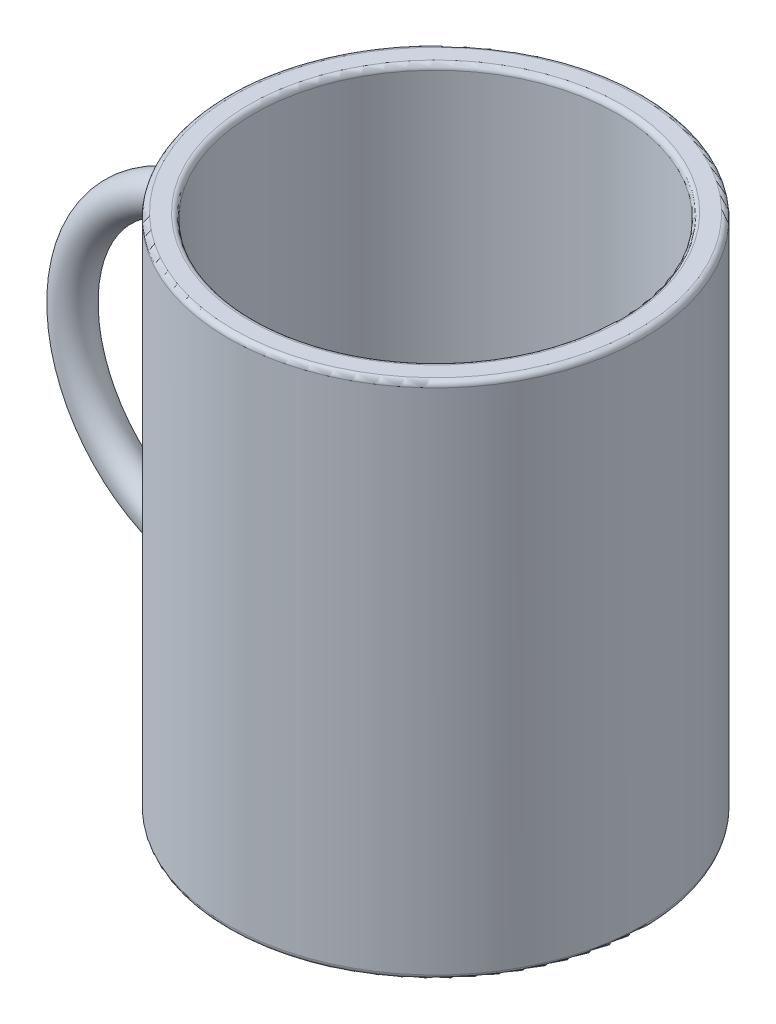
ISO-10303-21;
HEADER;
FILE_DESCRIPTION(('STEP AP214'),'2;1');
FILE_NAME('part.step','',(''),(''),'','','');
FILE_SCHEMA(('AUTOMOTIVE_DESIGN { 1 0 10303 214 1 1 1 1 }'));
ENDSEC;
DATA;
#1=APPLICATION_CONTEXT('core data for automotive mechanical design processes');
#2=APPLICATION_PROTOCOL_DEFINITION('international standard','automotive_design',2000,#1);
#3=PRODUCT_CONTEXT('',#1,'mechanical');
#4=PRODUCT('Part','Part','',(#3));
#5=PRODUCT_RELATED_PRODUCT_CATEGORY('part','',(#4));
#6=PRODUCT_DEFINITION_FORMATION('','',#4);
#7=PRODUCT_DEFINITION_CONTEXT('part definition',#1,'design');
#8=PRODUCT_DEFINITION('design','',#6,#7);
#9=PRODUCT_DEFINITION_SHAPE('','',#8);
#10=(LENGTH_UNIT() NAMED_UNIT(*) SI_UNIT(.MILLI.,.METRE.));
#11=(NAMED_UNIT(*) PLANE_ANGLE_UNIT() SI_UNIT($,.RADIAN.));
#12=(NAMED_UNIT(*) SI_UNIT($,.STERADIAN.) SOLID_ANGLE_UNIT());
#13=UNCERTAINTY_MEASURE_WITH_UNIT(LENGTH_MEASURE(1.E-05),#10,'distance_accuracy_value','');
#14=(GEOMETRIC_REPRESENTATION_CONTEXT(3) GLOBAL_UNCERTAINTY_ASSIGNED_CONTEXT((#13)) GLOBAL_UNIT_ASSIGNED_CONTEXT((#10,
#11,#12)) REPRESENTATION_CONTEXT('',''));
#15=CARTESIAN_POINT('',(0.,0.,0.));
#16=DIRECTION('',(0.,0.,1.));
#17=DIRECTION('',(1.,0.,0.));
#18=AXIS2_PLACEMENT_3D('',#15,#16,#17);
#19=CARTESIAN_POINT('',(-39.9999999999636,80.,0.));
#20=DIRECTION('',(1.,0.,0.));
#21=DIRECTION('',(0.,0.,-1.));
#22=AXIS2_PLACEMENT_3D('',#19,#20,#21);
#23=PLANE('',#22);
#24=CARTESIAN_POINT('',(-39.9999999999636,80.,0.));
#25=DIRECTION('',(1.,0.,0.));
#26=DIRECTION('',(0.,0.,-1.));
#27=AXIS2_PLACEMENT_3D('',#24,#25,#26);
#28=CIRCLE('',#27,3.5);
#29=CARTESIAN_POINT('',(-39.9999999999594,83.5,0.));
#30=VERTEX_POINT('',#29);
#31=EDGE_CURVE('E45',#30,#30,#28,.T.);
#32=ORIENTED_EDGE('',*,*,#31,.T.);
#33=EDGE_LOOP('',(#32));
#34=FACE_BOUND('',#33,.T.);
#35=ADVANCED_FACE('F39',(#34),#23,.T.);
#36=CARTESIAN_POINT('',(-40.000000000004,20.,0.));
#37=DIRECTION('',(-1.,-1.07969189144797E-12,0.));
#38=DIRECTION('',(0.,0.,-1.));
#39=AXIS2_PLACEMENT_3D('',#36,#37,#38);
#40=PLANE('',#39);
#41=CARTESIAN_POINT('',(-40.000000000004,20.,0.));
#42=DIRECTION('',(-1.,-1.07969189144797E-12,0.));
#43=DIRECTION('',(0.,0.,-1.));
#44=AXIS2_PLACEMENT_3D('',#41,#42,#43);
#45=CIRCLE('',#44,3.5);
#46=CARTESIAN_POINT('',(-40.0000000000045,16.5,0.));
#47=VERTEX_POINT('',#46);
#48=EDGE_CURVE('E11',#47,#47,#45,.T.);
#49=ORIENTED_EDGE('',*,*,#48,.F.);
#50=EDGE_LOOP('',(#49));
#51=FACE_BOUND('',#50,.T.);
#52=ADVANCED_FACE('F54',(#51),#40,.F.);
#53=CARTESIAN_POINT('',(-40.,50.,0.));
#54=DIRECTION('',(0.,0.,1.));
#55=DIRECTION('',(1.,0.,0.));
#56=AXIS2_PLACEMENT_3D('',#53,#54,#55);
#57=TOROIDAL_SURFACE('',#56,30.,3.5);
#58=CARTESIAN_POINT('',(-40.,50.,0.));
#59=DIRECTION('',(0.,0.,1.));
#60=DIRECTION('',(1.,0.,0.));
#61=AXIS2_PLACEMENT_3D('',#58,#59,#60);
#62=CIRCLE('',#61,33.5);
#63=EDGE_CURVE('',#30,#47,#62,.T.);
#64=ORIENTED_EDGE('',*,*,#31,.F.);
#65=ORIENTED_EDGE('',*,*,#48,.T.);
#66=ORIENTED_EDGE('',*,*,#63,.T.);
#67=ORIENTED_EDGE('',*,*,#63,.F.);
#68=EDGE_LOOP('',(#64,#66,#65,#67));
#69=FACE_BOUND('',#68,.T.);
#70=ADVANCED_FACE('F52',(#69),#57,.T.);
#71=CLOSED_SHELL('',(#35,#52,#70));
#72=MANIFOLD_SOLID_BREP('B2',#71);
#73=CARTESIAN_POINT('',(0.,0.,0.));
#74=DIRECTION('',(0.,1.,0.));
#75=DIRECTION('',(0.,0.,1.));
#76=AXIS2_PLACEMENT_3D('',#73,#74,#75);
#77=PLANE('',#76);
#78=CARTESIAN_POINT('',(0.,0.,0.));
#79=DIRECTION('',(0.,1.,0.));
#80=DIRECTION('',(0.,0.,1.));
#81=AXIS2_PLACEMENT_3D('',#78,#79,#80);
#82=CIRCLE('',#81,39.);
#83=CARTESIAN_POINT('',(0.,0.,39.));
#84=VERTEX_POINT('',#83);
#85=EDGE_CURVE('E38',#84,#84,#82,.F.);
#86=ORIENTED_EDGE('',*,*,#85,.T.);
#87=EDGE_LOOP('',(#86));
#88=FACE_BOUND('',#87,.T.);
#89=ADVANCED_FACE('F80',(#88),#77,.F.);
#90=CARTESIAN_POINT('',(0.,4.99999999999999,0.));
#91=DIRECTION('',(0.,1.,0.));
#92=DIRECTION('',(0.,0.,1.));
#93=AXIS2_PLACEMENT_3D('',#90,#91,#92);
#94=CYLINDRICAL_SURFACE('',#93,40.);
#95=CARTESIAN_POINT('',(0.,1.,0.));
#96=DIRECTION('',(0.,1.,0.));
#97=DIRECTION('',(0.,0.,1.));
#98=AXIS2_PLACEMENT_3D('',#95,#96,#97);
#99=CIRCLE('',#98,40.);
#100=CARTESIAN_POINT('',(0.,1.,40.));
#101=VERTEX_POINT('',#100);
#102=EDGE_CURVE('E87',#101,#101,#99,.T.);
#103=ORIENTED_EDGE('',*,*,#102,.T.);
#104=EDGE_LOOP('',(#103));
#105=FACE_BOUND('',#104,.T.);
#106=CARTESIAN_POINT('',(0.,99.,0.));
#107=DIRECTION('',(0.,-1.,0.));
#108=DIRECTION('',(0.,0.,-1.));
#109=AXIS2_PLACEMENT_3D('',#106,#107,#108);
#110=CIRCLE('',#109,40.);
#111=CARTESIAN_POINT('',(0.,99.,-40.));
#112=VERTEX_POINT('',#111);
#113=EDGE_CURVE('E106',#112,#112,#110,.T.);
#114=ORIENTED_EDGE('',*,*,#113,.T.);
#115=EDGE_LOOP('',(#114));
#116=FACE_BOUND('',#115,.T.);
#117=ADVANCED_FACE('F134',(#105,#116),#94,.T.);
#118=CARTESIAN_POINT('',(40.,100.,0.));
#119=DIRECTION('',(0.,-1.,0.));
#120=DIRECTION('',(0.,0.,-1.));
#121=AXIS2_PLACEMENT_3D('',#118,#119,#120);
#122=PLANE('',#121);
#123=CARTESIAN_POINT('',(0.,100.,0.));
#124=DIRECTION('',(0.,-1.,0.));
#125=DIRECTION('',(0.,0.,-1.));
#126=AXIS2_PLACEMENT_3D('',#123,#124,#125);
#127=CIRCLE('',#126,36.);
#128=CARTESIAN_POINT('',(0.,100.,-36.));
#129=VERTEX_POINT('',#128);
#130=EDGE_CURVE('E100',#129,#129,#127,.T.);
#131=ORIENTED_EDGE('',*,*,#130,.T.);
#132=EDGE_LOOP('',(#131));
#133=FACE_BOUND('',#132,.T.);
#134=CARTESIAN_POINT('',(0.,100.,0.));
#135=DIRECTION('',(0.,-1.,0.));
#136=DIRECTION('',(0.,0.,-1.));
#137=AXIS2_PLACEMENT_3D('',#134,#135,#136);
#138=CIRCLE('',#137,39.);
#139=CARTESIAN_POINT('',(0.,100.,-39.));
#140=VERTEX_POINT('',#139);
#141=EDGE_CURVE('E109',#140,#140,#138,.F.);
#142=ORIENTED_EDGE('',*,*,#141,.T.);
#143=EDGE_LOOP('',(#142));
#144=FACE_BOUND('',#143,.T.);
#145=ADVANCED_FACE('F113',(#133,#144),#122,.F.);
#146=CARTESIAN_POINT('',(0.,4.99999999999999,0.));
#147=DIRECTION('',(0.,1.,0.));
#148=DIRECTION('',(0.,0.,1.));
#149=AXIS2_PLACEMENT_3D('',#146,#147,#148);
#150=CYLINDRICAL_SURFACE('',#149,35.);
#151=CARTESIAN_POINT('',(0.,5.99999999999999,0.));
#152=DIRECTION('',(0.,-1.,0.));
#153=DIRECTION('',(0.,0.,-1.));
#154=AXIS2_PLACEMENT_3D('',#151,#152,#153);
#155=CIRCLE('',#154,35.);
#156=CARTESIAN_POINT('',(0.,5.99999999999999,-35.));
#157=VERTEX_POINT('',#156);
#158=EDGE_CURVE('E91',#157,#157,#155,.T.);
#159=ORIENTED_EDGE('',*,*,#158,.T.);
#160=EDGE_LOOP('',(#159));
#161=FACE_BOUND('',#160,.T.);
#162=CARTESIAN_POINT('',(0.,99.,0.));
#163=DIRECTION('',(0.,-1.,0.));
#164=DIRECTION('',(0.,0.,-1.));
#165=AXIS2_PLACEMENT_3D('',#162,#163,#164);
#166=CIRCLE('',#165,35.);
#167=CARTESIAN_POINT('',(0.,99.,-35.));
#168=VERTEX_POINT('',#167);
#169=EDGE_CURVE('E103',#168,#168,#166,.F.);
#170=ORIENTED_EDGE('',*,*,#169,.T.);
#171=EDGE_LOOP('',(#170));
#172=FACE_BOUND('',#171,.T.);
#173=ADVANCED_FACE('F128',(#161,#172),#150,.F.);
#174=CARTESIAN_POINT('',(35.,4.99999999999999,0.));
#175=DIRECTION('',(0.,-1.,0.));
#176=DIRECTION('',(0.,0.,-1.));
#177=AXIS2_PLACEMENT_3D('',#174,#175,#176);
#178=PLANE('',#177);
#179=CARTESIAN_POINT('',(0.,4.99999999999999,0.));
#180=DIRECTION('',(0.,-1.,0.));
#181=DIRECTION('',(0.,0.,-1.));
#182=AXIS2_PLACEMENT_3D('',#179,#180,#181);
#183=CIRCLE('',#182,34.);
#184=CARTESIAN_POINT('',(0.,4.99999999999999,-34.));
#185=VERTEX_POINT('',#184);
#186=EDGE_CURVE('E95',#185,#185,#183,.F.);
#187=ORIENTED_EDGE('',*,*,#186,.T.);
#188=EDGE_LOOP('',(#187));
#189=FACE_BOUND('',#188,.T.);
#190=ADVANCED_FACE('F118',(#189),#178,.F.);
#191=CARTESIAN_POINT('',(0.,99.,0.));
#192=DIRECTION('',(0.,-1.,0.));
#193=DIRECTION('',(0.,0.,-1.));
#194=AXIS2_PLACEMENT_3D('',#191,#192,#193);
#195=TOROIDAL_SURFACE('',#194,39.,1.);
#196=ORIENTED_EDGE('',*,*,#113,.F.);
#197=EDGE_LOOP('',(#196));
#198=FACE_BOUND('',#197,.T.);
#199=ORIENTED_EDGE('',*,*,#141,.F.);
#200=EDGE_LOOP('',(#199));
#201=FACE_BOUND('',#200,.T.);
#202=ADVANCED_FACE('F115',(#198,#201),#195,.T.);
#203=CARTESIAN_POINT('',(0.,99.,0.));
#204=DIRECTION('',(0.,-1.,0.));
#205=DIRECTION('',(0.,0.,-1.));
#206=AXIS2_PLACEMENT_3D('',#203,#204,#205);
#207=TOROIDAL_SURFACE('',#206,36.,1.);
#208=ORIENTED_EDGE('',*,*,#130,.F.);
#209=EDGE_LOOP('',(#208));
#210=FACE_BOUND('',#209,.T.);
#211=ORIENTED_EDGE('',*,*,#169,.F.);
#212=EDGE_LOOP('',(#211));
#213=FACE_BOUND('',#212,.T.);
#214=ADVANCED_FACE('F117',(#210,#213),#207,.T.);
#215=CARTESIAN_POINT('',(0.,5.99999999999999,0.));
#216=DIRECTION('',(0.,-1.,0.));
#217=DIRECTION('',(0.,0.,-1.));
#218=AXIS2_PLACEMENT_3D('',#215,#216,#217);
#219=TOROIDAL_SURFACE('',#218,34.,1.);
#220=ORIENTED_EDGE('',*,*,#158,.F.);
#221=EDGE_LOOP('',(#220));
#222=FACE_BOUND('',#221,.T.);
#223=ORIENTED_EDGE('',*,*,#186,.F.);
#224=EDGE_LOOP('',(#223));
#225=FACE_BOUND('',#224,.T.);
#226=ADVANCED_FACE('F125',(#222,#225),#219,.F.);
#227=CARTESIAN_POINT('',(0.,1.,0.));
#228=DIRECTION('',(0.,1.,0.));
#229=DIRECTION('',(0.,0.,1.));
#230=AXIS2_PLACEMENT_3D('',#227,#228,#229);
#231=TOROIDAL_SURFACE('',#230,39.,1.);
#232=ORIENTED_EDGE('',*,*,#85,.F.);
#233=EDGE_LOOP('',(#232));
#234=FACE_BOUND('',#233,.T.);
#235=ORIENTED_EDGE('',*,*,#102,.F.);
#236=EDGE_LOOP('',(#235));
#237=FACE_BOUND('',#236,.T.);
#238=ADVANCED_FACE('F82',(#234,#237),#231,.T.);
#239=CLOSED_SHELL('',(#89,#117,#145,#173,#190,#202,#214,#226,#238));
#240=MANIFOLD_SOLID_BREP('B6',#239);
#241=ADVANCED_BREP_SHAPE_REPRESENTATION('',(#18,#72,#240),#14);
#242=SHAPE_DEFINITION_REPRESENTATION(#9,#241);
ENDSEC;
END-ISO-10303-21;
